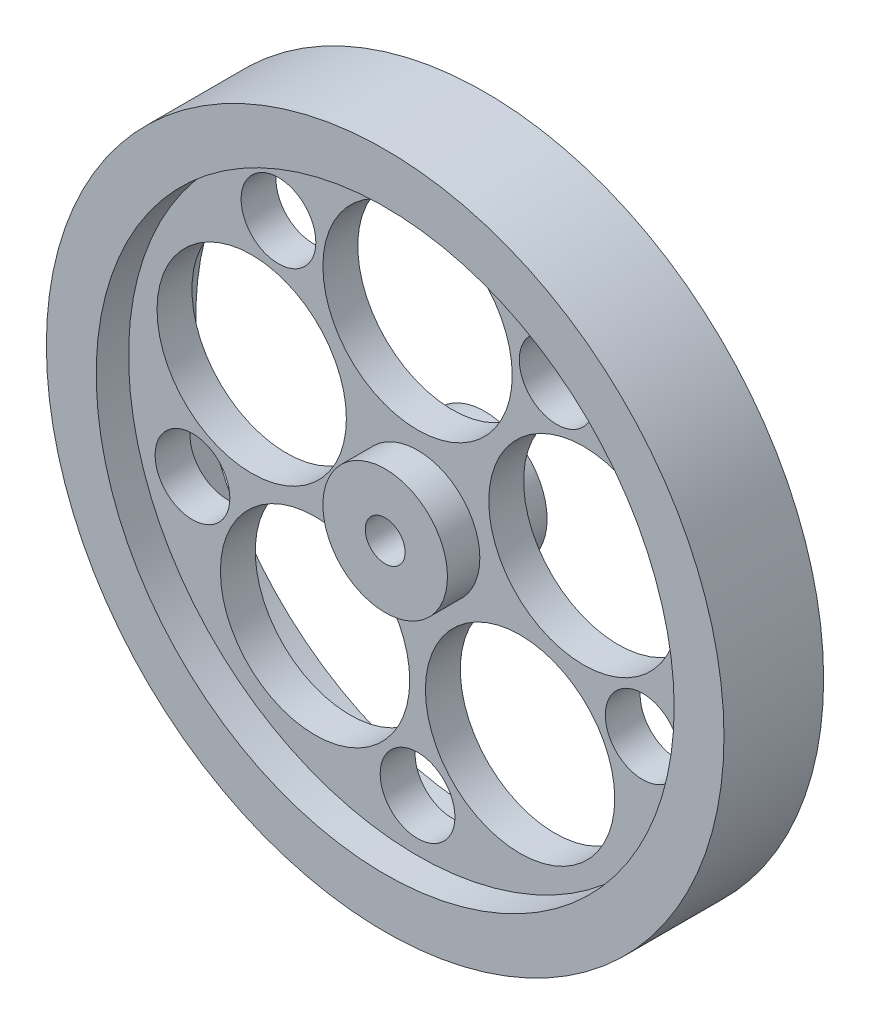
ISO-10303-21;
HEADER;
FILE_DESCRIPTION(('STEP AP214'),'2;1');
FILE_NAME('part.step','',(''),(''),'','','');
FILE_SCHEMA(('AUTOMOTIVE_DESIGN { 1 0 10303 214 1 1 1 1 }'));
ENDSEC;
DATA;
#1=APPLICATION_CONTEXT('core data for automotive mechanical design processes');
#2=APPLICATION_PROTOCOL_DEFINITION('international standard','automotive_design',2000,#1);
#3=PRODUCT_CONTEXT('',#1,'mechanical');
#4=PRODUCT('Part','Part','',(#3));
#5=PRODUCT_RELATED_PRODUCT_CATEGORY('part','',(#4));
#6=PRODUCT_DEFINITION_FORMATION('','',#4);
#7=PRODUCT_DEFINITION_CONTEXT('part definition',#1,'design');
#8=PRODUCT_DEFINITION('design','',#6,#7);
#9=PRODUCT_DEFINITION_SHAPE('','',#8);
#10=(LENGTH_UNIT() NAMED_UNIT(*) SI_UNIT(.MILLI.,.METRE.));
#11=(NAMED_UNIT(*) PLANE_ANGLE_UNIT() SI_UNIT($,.RADIAN.));
#12=(NAMED_UNIT(*) SI_UNIT($,.STERADIAN.) SOLID_ANGLE_UNIT());
#13=UNCERTAINTY_MEASURE_WITH_UNIT(LENGTH_MEASURE(1.E-05),#10,'distance_accuracy_value','');
#14=(GEOMETRIC_REPRESENTATION_CONTEXT(3) GLOBAL_UNCERTAINTY_ASSIGNED_CONTEXT((#13)) GLOBAL_UNIT_ASSIGNED_CONTEXT((#10,
#11,#12)) REPRESENTATION_CONTEXT('',''));
#15=CARTESIAN_POINT('',(0.,0.,0.));
#16=DIRECTION('',(0.,0.,1.));
#17=DIRECTION('',(1.,0.,0.));
#18=AXIS2_PLACEMENT_3D('',#15,#16,#17);
#19=CARTESIAN_POINT('',(0.,58.,10.));
#20=DIRECTION('',(0.,0.,-1.));
#21=DIRECTION('',(-1.,0.,0.));
#22=AXIS2_PLACEMENT_3D('',#19,#20,#21);
#23=PLANE('',#22);
#24=CARTESIAN_POINT('',(0.,0.,10.));
#25=DIRECTION('',(0.,0.,1.));
#26=DIRECTION('',(1.,0.,0.));
#27=AXIS2_PLACEMENT_3D('',#24,#25,#26);
#28=CIRCLE('',#27,58.);
#29=CARTESIAN_POINT('',(58.,0.,10.));
#30=VERTEX_POINT('',#29);
#31=EDGE_CURVE('E101',#30,#30,#28,.T.);
#32=ORIENTED_EDGE('',*,*,#31,.F.);
#33=EDGE_LOOP('',(#32));
#34=FACE_BOUND('',#33,.T.);
#35=CARTESIAN_POINT('',(0.,0.,10.));
#36=DIRECTION('',(0.,0.,1.));
#37=DIRECTION('',(1.,0.,0.));
#38=AXIS2_PLACEMENT_3D('',#35,#36,#37);
#39=CIRCLE('',#38,68.);
#40=CARTESIAN_POINT('',(68.,0.,10.));
#41=VERTEX_POINT('',#40);
#42=EDGE_CURVE('E10',#41,#41,#39,.T.);
#43=ORIENTED_EDGE('',*,*,#42,.T.);
#44=EDGE_LOOP('',(#43));
#45=FACE_BOUND('',#44,.T.);
#46=ADVANCED_FACE('F40',(#34,#45),#23,.F.);
#47=CARTESIAN_POINT('',(0.,0.,51.457627118644));
#48=DIRECTION('',(0.,0.,1.));
#49=DIRECTION('',(1.,0.,0.));
#50=AXIS2_PLACEMENT_3D('',#47,#48,#49);
#51=CYLINDRICAL_SURFACE('',#50,68.);
#52=ORIENTED_EDGE('',*,*,#42,.F.);
#53=EDGE_LOOP('',(#52));
#54=FACE_BOUND('',#53,.T.);
#55=CARTESIAN_POINT('',(0.,0.,-10.));
#56=DIRECTION('',(0.,0.,1.));
#57=DIRECTION('',(1.,0.,0.));
#58=AXIS2_PLACEMENT_3D('',#55,#56,#57);
#59=CIRCLE('',#58,68.);
#60=CARTESIAN_POINT('',(68.,0.,-10.));
#61=VERTEX_POINT('',#60);
#62=EDGE_CURVE('E42',#61,#61,#59,.T.);
#63=ORIENTED_EDGE('',*,*,#62,.T.);
#64=EDGE_LOOP('',(#63));
#65=FACE_BOUND('',#64,.T.);
#66=ADVANCED_FACE('F188',(#54,#65),#51,.T.);
#67=CARTESIAN_POINT('',(0.,68.,-10.));
#68=DIRECTION('',(0.,0.,1.));
#69=DIRECTION('',(1.,0.,0.));
#70=AXIS2_PLACEMENT_3D('',#67,#68,#69);
#71=PLANE('',#70);
#72=ORIENTED_EDGE('',*,*,#62,.F.);
#73=EDGE_LOOP('',(#72));
#74=FACE_BOUND('',#73,.T.);
#75=CARTESIAN_POINT('',(0.,0.,-10.));
#76=DIRECTION('',(0.,0.,1.));
#77=DIRECTION('',(1.,0.,0.));
#78=AXIS2_PLACEMENT_3D('',#75,#76,#77);
#79=CIRCLE('',#78,58.);
#80=CARTESIAN_POINT('',(58.,0.,-10.));
#81=VERTEX_POINT('',#80);
#82=EDGE_CURVE('E47',#81,#81,#79,.T.);
#83=ORIENTED_EDGE('',*,*,#82,.T.);
#84=EDGE_LOOP('',(#83));
#85=FACE_BOUND('',#84,.T.);
#86=ADVANCED_FACE('F128',(#74,#85),#71,.F.);
#87=CARTESIAN_POINT('',(0.,0.,51.457627118644));
#88=DIRECTION('',(0.,0.,1.));
#89=DIRECTION('',(1.,0.,0.));
#90=AXIS2_PLACEMENT_3D('',#87,#88,#89);
#91=CYLINDRICAL_SURFACE('',#90,58.);
#92=ORIENTED_EDGE('',*,*,#82,.F.);
#93=EDGE_LOOP('',(#92));
#94=FACE_BOUND('',#93,.T.);
#95=CARTESIAN_POINT('',(0.,0.,-3.5));
#96=DIRECTION('',(0.,0.,1.));
#97=DIRECTION('',(1.,0.,0.));
#98=AXIS2_PLACEMENT_3D('',#95,#96,#97);
#99=CIRCLE('',#98,58.);
#100=CARTESIAN_POINT('',(58.,0.,-3.5));
#101=VERTEX_POINT('',#100);
#102=EDGE_CURVE('E123',#101,#101,#99,.T.);
#103=ORIENTED_EDGE('',*,*,#102,.T.);
#104=EDGE_LOOP('',(#103));
#105=FACE_BOUND('',#104,.T.);
#106=ADVANCED_FACE('F135',(#94,#105),#91,.F.);
#107=CARTESIAN_POINT('',(0.,58.,-3.5));
#108=DIRECTION('',(0.,0.,1.));
#109=DIRECTION('',(1.,0.,0.));
#110=AXIS2_PLACEMENT_3D('',#107,#108,#109);
#111=PLANE('',#110);
#112=CARTESIAN_POINT('',(-20.5706748132424,-28.3161825883753,-3.5));
#113=DIRECTION('',(0.,0.,1.));
#114=DIRECTION('',(1.,0.,0.));
#115=AXIS2_PLACEMENT_3D('',#112,#113,#114);
#116=CIRCLE('',#115,19.);
#117=CARTESIAN_POINT('',(-1.57067481324243,-28.3161825883753,-3.5));
#118=VERTEX_POINT('',#117);
#119=EDGE_CURVE('E98',#118,#118,#116,.T.);
#120=ORIENTED_EDGE('',*,*,#119,.T.);
#121=EDGE_LOOP('',(#120));
#122=FACE_BOUND('',#121,.T.);
#123=CARTESIAN_POINT('',(20.5742928472308,-28.315007017871,-3.5));
#124=DIRECTION('',(0.,0.,1.));
#125=DIRECTION('',(1.,0.,0.));
#126=AXIS2_PLACEMENT_3D('',#123,#124,#125);
#127=CIRCLE('',#126,19.);
#128=CARTESIAN_POINT('',(39.5742928472308,-28.315007017871,-3.5));
#129=VERTEX_POINT('',#128);
#130=EDGE_CURVE('E88',#129,#129,#127,.T.);
#131=ORIENTED_EDGE('',*,*,#130,.T.);
#132=EDGE_LOOP('',(#131));
#133=FACE_BOUND('',#132,.T.);
#134=CARTESIAN_POINT('',(0.,35.,-3.5));
#135=DIRECTION('',(0.,0.,1.));
#136=DIRECTION('',(1.,0.,0.));
#137=AXIS2_PLACEMENT_3D('',#134,#135,#136);
#138=CIRCLE('',#137,19.);
#139=CARTESIAN_POINT('',(19.,35.,-3.5));
#140=VERTEX_POINT('',#139);
#141=EDGE_CURVE('E84',#140,#140,#138,.T.);
#142=ORIENTED_EDGE('',*,*,#141,.T.);
#143=EDGE_LOOP('',(#142));
#144=FACE_BOUND('',#143,.T.);
#145=CARTESIAN_POINT('',(33.287669053336,10.8165458596394,-3.5));
#146=DIRECTION('',(0.,0.,1.));
#147=DIRECTION('',(1.,0.,0.));
#148=AXIS2_PLACEMENT_3D('',#145,#146,#147);
#149=CIRCLE('',#148,19.);
#150=CARTESIAN_POINT('',(52.2876690533361,10.8165458596394,-3.5));
#151=VERTEX_POINT('',#150);
#152=EDGE_CURVE('E78',#151,#151,#149,.T.);
#153=ORIENTED_EDGE('',*,*,#152,.T.);
#154=EDGE_LOOP('',(#153));
#155=FACE_BOUND('',#154,.T.);
#156=CARTESIAN_POINT('',(-45.1751845240198,-14.67830723281,-3.5));
#157=DIRECTION('',(0.,0.,1.));
#158=DIRECTION('',(1.,0.,0.));
#159=AXIS2_PLACEMENT_3D('',#156,#157,#158);
#160=CIRCLE('',#159,7.50000000000053);
#161=CARTESIAN_POINT('',(-37.6751845240193,-14.67830723281,-3.5));
#162=VERTEX_POINT('',#161);
#163=EDGE_CURVE('E77',#162,#162,#160,.T.);
#164=ORIENTED_EDGE('',*,*,#163,.T.);
#165=EDGE_LOOP('',(#164));
#166=FACE_BOUND('',#165,.T.);
#167=CARTESIAN_POINT('',(-27.9197994838928,38.4283072328097,-3.5));
#168=DIRECTION('',(0.,0.,1.));
#169=DIRECTION('',(1.,0.,0.));
#170=AXIS2_PLACEMENT_3D('',#167,#168,#169);
#171=CIRCLE('',#170,7.50000000000001);
#172=CARTESIAN_POINT('',(-20.4197994838928,38.4283072328097,-3.5));
#173=VERTEX_POINT('',#172);
#174=EDGE_CURVE('E75',#173,#173,#171,.T.);
#175=ORIENTED_EDGE('',*,*,#174,.T.);
#176=EDGE_LOOP('',(#175));
#177=FACE_BOUND('',#176,.T.);
#178=CARTESIAN_POINT('',(27.9197994838923,38.4283072328102,-3.5));
#179=DIRECTION('',(0.,0.,1.));
#180=DIRECTION('',(1.,0.,0.));
#181=AXIS2_PLACEMENT_3D('',#178,#179,#180);
#182=CIRCLE('',#181,7.50000000000001);
#183=CARTESIAN_POINT('',(35.4197994838923,38.4283072328102,-3.5));
#184=VERTEX_POINT('',#183);
#185=EDGE_CURVE('E69',#184,#184,#182,.T.);
#186=ORIENTED_EDGE('',*,*,#185,.T.);
#187=EDGE_LOOP('',(#186));
#188=FACE_BOUND('',#187,.T.);
#189=CARTESIAN_POINT('',(45.1751845240198,-14.6783072328099,-3.5));
#190=DIRECTION('',(0.,0.,1.));
#191=DIRECTION('',(1.,0.,0.));
#192=AXIS2_PLACEMENT_3D('',#189,#190,#191);
#193=CIRCLE('',#192,7.50000000000001);
#194=CARTESIAN_POINT('',(52.6751845240199,-14.6783072328099,-3.5));
#195=VERTEX_POINT('',#194);
#196=EDGE_CURVE('E61',#195,#195,#193,.T.);
#197=ORIENTED_EDGE('',*,*,#196,.T.);
#198=EDGE_LOOP('',(#197));
#199=FACE_BOUND('',#198,.T.);
#200=CARTESIAN_POINT('',(-33.2862870873246,10.8146437466072,-3.5));
#201=DIRECTION('',(0.,0.,1.));
#202=DIRECTION('',(1.,0.,0.));
#203=AXIS2_PLACEMENT_3D('',#200,#201,#202);
#204=CIRCLE('',#203,19.);
#205=CARTESIAN_POINT('',(-14.2862870873246,10.8146437466072,-3.5));
#206=VERTEX_POINT('',#205);
#207=EDGE_CURVE('E58',#206,#206,#204,.T.);
#208=ORIENTED_EDGE('',*,*,#207,.T.);
#209=EDGE_LOOP('',(#208));
#210=FACE_BOUND('',#209,.T.);
#211=CARTESIAN_POINT('',(0.,-47.5,-3.5));
#212=DIRECTION('',(0.,0.,1.));
#213=DIRECTION('',(1.,0.,0.));
#214=AXIS2_PLACEMENT_3D('',#211,#212,#213);
#215=CIRCLE('',#214,7.5);
#216=CARTESIAN_POINT('',(7.5,-47.5,-3.5));
#217=VERTEX_POINT('',#216);
#218=EDGE_CURVE('E57',#217,#217,#215,.T.);
#219=ORIENTED_EDGE('',*,*,#218,.T.);
#220=EDGE_LOOP('',(#219));
#221=FACE_BOUND('',#220,.T.);
#222=ORIENTED_EDGE('',*,*,#102,.F.);
#223=EDGE_LOOP('',(#222));
#224=FACE_BOUND('',#223,.T.);
#225=CARTESIAN_POINT('',(0.,0.,-3.5));
#226=DIRECTION('',(0.,0.,1.));
#227=DIRECTION('',(1.,0.,0.));
#228=AXIS2_PLACEMENT_3D('',#225,#226,#227);
#229=CIRCLE('',#228,12.5);
#230=CARTESIAN_POINT('',(12.5,0.,-3.5));
#231=VERTEX_POINT('',#230);
#232=EDGE_CURVE('E125',#231,#231,#229,.T.);
#233=ORIENTED_EDGE('',*,*,#232,.T.);
#234=EDGE_LOOP('',(#233));
#235=FACE_BOUND('',#234,.T.);
#236=ADVANCED_FACE('F133',(#122,#133,#144,#155,#166,#177,#188,#199,#210,#221,#224,#235),#111,.F.);
#237=CARTESIAN_POINT('',(0.,0.,51.457627118644));
#238=DIRECTION('',(0.,0.,1.));
#239=DIRECTION('',(1.,0.,0.));
#240=AXIS2_PLACEMENT_3D('',#237,#238,#239);
#241=CYLINDRICAL_SURFACE('',#240,12.5);
#242=ORIENTED_EDGE('',*,*,#232,.F.);
#243=EDGE_LOOP('',(#242));
#244=FACE_BOUND('',#243,.T.);
#245=CARTESIAN_POINT('',(0.,0.,-10.));
#246=DIRECTION('',(0.,0.,1.));
#247=DIRECTION('',(1.,0.,0.));
#248=AXIS2_PLACEMENT_3D('',#245,#246,#247);
#249=CIRCLE('',#248,12.5);
#250=CARTESIAN_POINT('',(12.5,0.,-10.));
#251=VERTEX_POINT('',#250);
#252=EDGE_CURVE('E116',#251,#251,#249,.T.);
#253=ORIENTED_EDGE('',*,*,#252,.T.);
#254=EDGE_LOOP('',(#253));
#255=FACE_BOUND('',#254,.T.);
#256=ADVANCED_FACE('F143',(#244,#255),#241,.T.);
#257=CARTESIAN_POINT('',(0.,12.5,-10.));
#258=DIRECTION('',(0.,0.,1.));
#259=DIRECTION('',(1.,0.,0.));
#260=AXIS2_PLACEMENT_3D('',#257,#258,#259);
#261=PLANE('',#260);
#262=ORIENTED_EDGE('',*,*,#252,.F.);
#263=EDGE_LOOP('',(#262));
#264=FACE_BOUND('',#263,.T.);
#265=CARTESIAN_POINT('',(0.,0.,-10.));
#266=DIRECTION('',(0.,0.,1.));
#267=DIRECTION('',(1.,0.,0.));
#268=AXIS2_PLACEMENT_3D('',#265,#266,#267);
#269=CIRCLE('',#268,4.);
#270=CARTESIAN_POINT('',(4.,0.,-10.));
#271=VERTEX_POINT('',#270);
#272=EDGE_CURVE('E117',#271,#271,#269,.T.);
#273=ORIENTED_EDGE('',*,*,#272,.T.);
#274=EDGE_LOOP('',(#273));
#275=FACE_BOUND('',#274,.T.);
#276=ADVANCED_FACE('F146',(#264,#275),#261,.F.);
#277=CARTESIAN_POINT('',(0.,0.,51.457627118644));
#278=DIRECTION('',(0.,0.,1.));
#279=DIRECTION('',(1.,0.,0.));
#280=AXIS2_PLACEMENT_3D('',#277,#278,#279);
#281=CYLINDRICAL_SURFACE('',#280,4.);
#282=ORIENTED_EDGE('',*,*,#272,.F.);
#283=EDGE_LOOP('',(#282));
#284=FACE_BOUND('',#283,.T.);
#285=CARTESIAN_POINT('',(0.,0.,9.99999999999999));
#286=DIRECTION('',(0.,0.,1.));
#287=DIRECTION('',(1.,0.,0.));
#288=AXIS2_PLACEMENT_3D('',#285,#286,#287);
#289=CIRCLE('',#288,4.);
#290=CARTESIAN_POINT('',(4.,0.,9.99999999999999));
#291=VERTEX_POINT('',#290);
#292=EDGE_CURVE('E114',#291,#291,#289,.T.);
#293=ORIENTED_EDGE('',*,*,#292,.T.);
#294=EDGE_LOOP('',(#293));
#295=FACE_BOUND('',#294,.T.);
#296=ADVANCED_FACE('F152',(#284,#295),#281,.F.);
#297=CARTESIAN_POINT('',(0.,4.,9.99999999999999));
#298=DIRECTION('',(0.,0.,-1.));
#299=DIRECTION('',(-1.,0.,0.));
#300=AXIS2_PLACEMENT_3D('',#297,#298,#299);
#301=PLANE('',#300);
#302=ORIENTED_EDGE('',*,*,#292,.F.);
#303=EDGE_LOOP('',(#302));
#304=FACE_BOUND('',#303,.T.);
#305=CARTESIAN_POINT('',(0.,0.,9.99999999999999));
#306=DIRECTION('',(0.,0.,1.));
#307=DIRECTION('',(1.,0.,0.));
#308=AXIS2_PLACEMENT_3D('',#305,#306,#307);
#309=CIRCLE('',#308,12.5);
#310=CARTESIAN_POINT('',(12.5,0.,9.99999999999999));
#311=VERTEX_POINT('',#310);
#312=EDGE_CURVE('E109',#311,#311,#309,.T.);
#313=ORIENTED_EDGE('',*,*,#312,.T.);
#314=EDGE_LOOP('',(#313));
#315=FACE_BOUND('',#314,.T.);
#316=ADVANCED_FACE('F159',(#304,#315),#301,.F.);
#317=CARTESIAN_POINT('',(0.,0.,51.457627118644));
#318=DIRECTION('',(0.,0.,1.));
#319=DIRECTION('',(1.,0.,0.));
#320=AXIS2_PLACEMENT_3D('',#317,#318,#319);
#321=CYLINDRICAL_SURFACE('',#320,12.5);
#322=ORIENTED_EDGE('',*,*,#312,.F.);
#323=EDGE_LOOP('',(#322));
#324=FACE_BOUND('',#323,.T.);
#325=CARTESIAN_POINT('',(0.,0.,3.5));
#326=DIRECTION('',(0.,0.,1.));
#327=DIRECTION('',(1.,0.,0.));
#328=AXIS2_PLACEMENT_3D('',#325,#326,#327);
#329=CIRCLE('',#328,12.5);
#330=CARTESIAN_POINT('',(12.5,0.,3.5));
#331=VERTEX_POINT('',#330);
#332=EDGE_CURVE('E110',#331,#331,#329,.T.);
#333=ORIENTED_EDGE('',*,*,#332,.T.);
#334=EDGE_LOOP('',(#333));
#335=FACE_BOUND('',#334,.T.);
#336=ADVANCED_FACE('F167',(#324,#335),#321,.T.);
#337=CARTESIAN_POINT('',(0.,12.5,3.49999999999999));
#338=DIRECTION('',(0.,0.,-1.));
#339=DIRECTION('',(-1.,0.,0.));
#340=AXIS2_PLACEMENT_3D('',#337,#338,#339);
#341=PLANE('',#340);
#342=CARTESIAN_POINT('',(-20.5706748132424,-28.3161825883753,3.49999999999999));
#343=DIRECTION('',(0.,0.,-1.));
#344=DIRECTION('',(-1.,0.,0.));
#345=AXIS2_PLACEMENT_3D('',#342,#343,#344);
#346=CIRCLE('',#345,19.);
#347=CARTESIAN_POINT('',(-39.5706748132424,-28.3161825883753,3.49999999999999));
#348=VERTEX_POINT('',#347);
#349=EDGE_CURVE('E37',#348,#348,#346,.T.);
#350=ORIENTED_EDGE('',*,*,#349,.T.);
#351=EDGE_LOOP('',(#350));
#352=FACE_BOUND('',#351,.T.);
#353=CARTESIAN_POINT('',(20.5742928472308,-28.315007017871,3.49999999999999));
#354=DIRECTION('',(0.,0.,-1.));
#355=DIRECTION('',(-1.,0.,0.));
#356=AXIS2_PLACEMENT_3D('',#353,#354,#355);
#357=CIRCLE('',#356,19.);
#358=CARTESIAN_POINT('',(1.57429284723077,-28.315007017871,3.49999999999999));
#359=VERTEX_POINT('',#358);
#360=EDGE_CURVE('E81',#359,#359,#357,.T.);
#361=ORIENTED_EDGE('',*,*,#360,.T.);
#362=EDGE_LOOP('',(#361));
#363=FACE_BOUND('',#362,.T.);
#364=CARTESIAN_POINT('',(0.,35.,3.49999999999999));
#365=DIRECTION('',(0.,0.,-1.));
#366=DIRECTION('',(-1.,0.,0.));
#367=AXIS2_PLACEMENT_3D('',#364,#365,#366);
#368=CIRCLE('',#367,19.);
#369=CARTESIAN_POINT('',(-19.,35.,3.49999999999999));
#370=VERTEX_POINT('',#369);
#371=EDGE_CURVE('E82',#370,#370,#368,.T.);
#372=ORIENTED_EDGE('',*,*,#371,.T.);
#373=EDGE_LOOP('',(#372));
#374=FACE_BOUND('',#373,.T.);
#375=CARTESIAN_POINT('',(33.287669053336,10.8165458596394,3.49999999999999));
#376=DIRECTION('',(0.,0.,-1.));
#377=DIRECTION('',(-1.,0.,0.));
#378=AXIS2_PLACEMENT_3D('',#375,#376,#377);
#379=CIRCLE('',#378,19.);
#380=CARTESIAN_POINT('',(14.287669053336,10.8165458596394,3.49999999999999));
#381=VERTEX_POINT('',#380);
#382=EDGE_CURVE('E80',#381,#381,#379,.T.);
#383=ORIENTED_EDGE('',*,*,#382,.T.);
#384=EDGE_LOOP('',(#383));
#385=FACE_BOUND('',#384,.T.);
#386=CARTESIAN_POINT('',(-45.1751845240198,-14.67830723281,3.49999999999999));
#387=DIRECTION('',(0.,0.,-1.));
#388=DIRECTION('',(-1.,0.,0.));
#389=AXIS2_PLACEMENT_3D('',#386,#387,#388);
#390=CIRCLE('',#389,7.50000000000053);
#391=CARTESIAN_POINT('',(-52.6751845240203,-14.67830723281,3.49999999999999));
#392=VERTEX_POINT('',#391);
#393=EDGE_CURVE('E71',#392,#392,#390,.T.);
#394=ORIENTED_EDGE('',*,*,#393,.T.);
#395=EDGE_LOOP('',(#394));
#396=FACE_BOUND('',#395,.T.);
#397=CARTESIAN_POINT('',(-27.9197994838928,38.4283072328097,3.49999999999999));
#398=DIRECTION('',(0.,0.,-1.));
#399=DIRECTION('',(-1.,0.,0.));
#400=AXIS2_PLACEMENT_3D('',#397,#398,#399);
#401=CIRCLE('',#400,7.50000000000001);
#402=CARTESIAN_POINT('',(-35.4197994838928,38.4283072328097,3.49999999999999));
#403=VERTEX_POINT('',#402);
#404=EDGE_CURVE('E66',#403,#403,#401,.T.);
#405=ORIENTED_EDGE('',*,*,#404,.T.);
#406=EDGE_LOOP('',(#405));
#407=FACE_BOUND('',#406,.T.);
#408=CARTESIAN_POINT('',(27.9197994838923,38.4283072328102,3.49999999999999));
#409=DIRECTION('',(0.,0.,-1.));
#410=DIRECTION('',(-1.,0.,0.));
#411=AXIS2_PLACEMENT_3D('',#408,#409,#410);
#412=CIRCLE('',#411,7.50000000000001);
#413=CARTESIAN_POINT('',(20.4197994838923,38.4283072328102,3.49999999999999));
#414=VERTEX_POINT('',#413);
#415=EDGE_CURVE('E63',#414,#414,#412,.T.);
#416=ORIENTED_EDGE('',*,*,#415,.T.);
#417=EDGE_LOOP('',(#416));
#418=FACE_BOUND('',#417,.T.);
#419=CARTESIAN_POINT('',(45.1751845240198,-14.6783072328099,3.49999999999999));
#420=DIRECTION('',(0.,0.,-1.));
#421=DIRECTION('',(-1.,0.,0.));
#422=AXIS2_PLACEMENT_3D('',#419,#420,#421);
#423=CIRCLE('',#422,7.50000000000001);
#424=CARTESIAN_POINT('',(37.6751845240198,-14.6783072328099,3.49999999999999));
#425=VERTEX_POINT('',#424);
#426=EDGE_CURVE('E62',#425,#425,#423,.T.);
#427=ORIENTED_EDGE('',*,*,#426,.T.);
#428=EDGE_LOOP('',(#427));
#429=FACE_BOUND('',#428,.T.);
#430=CARTESIAN_POINT('',(-33.2862870873246,10.8146437466072,3.49999999999999));
#431=DIRECTION('',(0.,0.,-1.));
#432=DIRECTION('',(-1.,0.,0.));
#433=AXIS2_PLACEMENT_3D('',#430,#431,#432);
#434=CIRCLE('',#433,19.);
#435=CARTESIAN_POINT('',(-52.2862870873246,10.8146437466072,3.49999999999999));
#436=VERTEX_POINT('',#435);
#437=EDGE_CURVE('E60',#436,#436,#434,.T.);
#438=ORIENTED_EDGE('',*,*,#437,.T.);
#439=EDGE_LOOP('',(#438));
#440=FACE_BOUND('',#439,.T.);
#441=CARTESIAN_POINT('',(0.,-47.5,3.49999999999999));
#442=DIRECTION('',(0.,0.,-1.));
#443=DIRECTION('',(-1.,0.,0.));
#444=AXIS2_PLACEMENT_3D('',#441,#442,#443);
#445=CIRCLE('',#444,7.5);
#446=CARTESIAN_POINT('',(-7.5,-47.5,3.49999999999999));
#447=VERTEX_POINT('',#446);
#448=EDGE_CURVE('E52',#447,#447,#445,.T.);
#449=ORIENTED_EDGE('',*,*,#448,.T.);
#450=EDGE_LOOP('',(#449));
#451=FACE_BOUND('',#450,.T.);
#452=ORIENTED_EDGE('',*,*,#332,.F.);
#453=EDGE_LOOP('',(#452));
#454=FACE_BOUND('',#453,.T.);
#455=CARTESIAN_POINT('',(0.,0.,3.5));
#456=DIRECTION('',(0.,0.,1.));
#457=DIRECTION('',(1.,0.,0.));
#458=AXIS2_PLACEMENT_3D('',#455,#456,#457);
#459=CIRCLE('',#458,58.);
#460=CARTESIAN_POINT('',(58.,0.,3.5));
#461=VERTEX_POINT('',#460);
#462=EDGE_CURVE('E102',#461,#461,#459,.T.);
#463=ORIENTED_EDGE('',*,*,#462,.T.);
#464=EDGE_LOOP('',(#463));
#465=FACE_BOUND('',#464,.T.);
#466=ADVANCED_FACE('F175',(#352,#363,#374,#385,#396,#407,#418,#429,#440,#451,#454,#465),#341,.F.);
#467=CARTESIAN_POINT('',(0.,0.,51.457627118644));
#468=DIRECTION('',(0.,0.,1.));
#469=DIRECTION('',(1.,0.,0.));
#470=AXIS2_PLACEMENT_3D('',#467,#468,#469);
#471=CYLINDRICAL_SURFACE('',#470,58.);
#472=ORIENTED_EDGE('',*,*,#462,.F.);
#473=EDGE_LOOP('',(#472));
#474=FACE_BOUND('',#473,.T.);
#475=ORIENTED_EDGE('',*,*,#31,.T.);
#476=EDGE_LOOP('',(#475));
#477=FACE_BOUND('',#476,.T.);
#478=ADVANCED_FACE('F179',(#474,#477),#471,.F.);
#479=CARTESIAN_POINT('',(0.,-47.5,-10.));
#480=DIRECTION('',(0.,0.,1.));
#481=DIRECTION('',(1.,0.,0.));
#482=AXIS2_PLACEMENT_3D('',#479,#480,#481);
#483=CYLINDRICAL_SURFACE('',#482,7.5);
#484=ORIENTED_EDGE('',*,*,#448,.F.);
#485=EDGE_LOOP('',(#484));
#486=FACE_BOUND('',#485,.T.);
#487=ORIENTED_EDGE('',*,*,#218,.F.);
#488=EDGE_LOOP('',(#487));
#489=FACE_BOUND('',#488,.T.);
#490=ADVANCED_FACE('F183',(#486,#489),#483,.F.);
#491=CARTESIAN_POINT('',(-33.2862870873246,10.8146437466072,-10.));
#492=DIRECTION('',(0.,0.,1.));
#493=DIRECTION('',(1.,0.,0.));
#494=AXIS2_PLACEMENT_3D('',#491,#492,#493);
#495=CYLINDRICAL_SURFACE('',#494,19.);
#496=ORIENTED_EDGE('',*,*,#437,.F.);
#497=EDGE_LOOP('',(#496));
#498=FACE_BOUND('',#497,.T.);
#499=ORIENTED_EDGE('',*,*,#207,.F.);
#500=EDGE_LOOP('',(#499));
#501=FACE_BOUND('',#500,.T.);
#502=ADVANCED_FACE('F204',(#498,#501),#495,.F.);
#503=CARTESIAN_POINT('',(45.1751845240198,-14.6783072328099,-10.));
#504=DIRECTION('',(0.,0.,1.));
#505=DIRECTION('',(1.,0.,0.));
#506=AXIS2_PLACEMENT_3D('',#503,#504,#505);
#507=CYLINDRICAL_SURFACE('',#506,7.50000000000001);
#508=ORIENTED_EDGE('',*,*,#426,.F.);
#509=EDGE_LOOP('',(#508));
#510=FACE_BOUND('',#509,.T.);
#511=ORIENTED_EDGE('',*,*,#196,.F.);
#512=EDGE_LOOP('',(#511));
#513=FACE_BOUND('',#512,.T.);
#514=ADVANCED_FACE('F217',(#510,#513),#507,.F.);
#515=CARTESIAN_POINT('',(27.9197994838923,38.4283072328102,-10.));
#516=DIRECTION('',(0.,0.,1.));
#517=DIRECTION('',(1.,0.,0.));
#518=AXIS2_PLACEMENT_3D('',#515,#516,#517);
#519=CYLINDRICAL_SURFACE('',#518,7.50000000000001);
#520=ORIENTED_EDGE('',*,*,#415,.F.);
#521=EDGE_LOOP('',(#520));
#522=FACE_BOUND('',#521,.T.);
#523=ORIENTED_EDGE('',*,*,#185,.F.);
#524=EDGE_LOOP('',(#523));
#525=FACE_BOUND('',#524,.T.);
#526=ADVANCED_FACE('F212',(#522,#525),#519,.F.);
#527=CARTESIAN_POINT('',(-27.9197994838928,38.4283072328097,-10.));
#528=DIRECTION('',(0.,0.,1.));
#529=DIRECTION('',(1.,0.,0.));
#530=AXIS2_PLACEMENT_3D('',#527,#528,#529);
#531=CYLINDRICAL_SURFACE('',#530,7.50000000000001);
#532=ORIENTED_EDGE('',*,*,#404,.F.);
#533=EDGE_LOOP('',(#532));
#534=FACE_BOUND('',#533,.T.);
#535=ORIENTED_EDGE('',*,*,#174,.F.);
#536=EDGE_LOOP('',(#535));
#537=FACE_BOUND('',#536,.T.);
#538=ADVANCED_FACE('F209',(#534,#537),#531,.F.);
#539=CARTESIAN_POINT('',(-45.1751845240198,-14.67830723281,-10.));
#540=DIRECTION('',(0.,0.,1.));
#541=DIRECTION('',(1.,0.,0.));
#542=AXIS2_PLACEMENT_3D('',#539,#540,#541);
#543=CYLINDRICAL_SURFACE('',#542,7.50000000000053);
#544=ORIENTED_EDGE('',*,*,#393,.F.);
#545=EDGE_LOOP('',(#544));
#546=FACE_BOUND('',#545,.T.);
#547=ORIENTED_EDGE('',*,*,#163,.F.);
#548=EDGE_LOOP('',(#547));
#549=FACE_BOUND('',#548,.T.);
#550=ADVANCED_FACE('F206',(#546,#549),#543,.F.);
#551=CARTESIAN_POINT('',(33.287669053336,10.8165458596394,-10.));
#552=DIRECTION('',(0.,0.,1.));
#553=DIRECTION('',(1.,0.,0.));
#554=AXIS2_PLACEMENT_3D('',#551,#552,#553);
#555=CYLINDRICAL_SURFACE('',#554,19.);
#556=ORIENTED_EDGE('',*,*,#382,.F.);
#557=EDGE_LOOP('',(#556));
#558=FACE_BOUND('',#557,.T.);
#559=ORIENTED_EDGE('',*,*,#152,.F.);
#560=EDGE_LOOP('',(#559));
#561=FACE_BOUND('',#560,.T.);
#562=ADVANCED_FACE('F207',(#558,#561),#555,.F.);
#563=CARTESIAN_POINT('',(0.,35.,-10.));
#564=DIRECTION('',(0.,0.,1.));
#565=DIRECTION('',(1.,0.,0.));
#566=AXIS2_PLACEMENT_3D('',#563,#564,#565);
#567=CYLINDRICAL_SURFACE('',#566,19.);
#568=ORIENTED_EDGE('',*,*,#371,.F.);
#569=EDGE_LOOP('',(#568));
#570=FACE_BOUND('',#569,.T.);
#571=ORIENTED_EDGE('',*,*,#141,.F.);
#572=EDGE_LOOP('',(#571));
#573=FACE_BOUND('',#572,.T.);
#574=ADVANCED_FACE('F228',(#570,#573),#567,.F.);
#575=CARTESIAN_POINT('',(20.5742928472308,-28.315007017871,-10.));
#576=DIRECTION('',(0.,0.,1.));
#577=DIRECTION('',(1.,0.,0.));
#578=AXIS2_PLACEMENT_3D('',#575,#576,#577);
#579=CYLINDRICAL_SURFACE('',#578,19.);
#580=ORIENTED_EDGE('',*,*,#360,.F.);
#581=EDGE_LOOP('',(#580));
#582=FACE_BOUND('',#581,.T.);
#583=ORIENTED_EDGE('',*,*,#130,.F.);
#584=EDGE_LOOP('',(#583));
#585=FACE_BOUND('',#584,.T.);
#586=ADVANCED_FACE('F227',(#582,#585),#579,.F.);
#587=CARTESIAN_POINT('',(-20.5706748132424,-28.3161825883753,-10.));
#588=DIRECTION('',(0.,0.,1.));
#589=DIRECTION('',(1.,0.,0.));
#590=AXIS2_PLACEMENT_3D('',#587,#588,#589);
#591=CYLINDRICAL_SURFACE('',#590,19.);
#592=ORIENTED_EDGE('',*,*,#349,.F.);
#593=EDGE_LOOP('',(#592));
#594=FACE_BOUND('',#593,.T.);
#595=ORIENTED_EDGE('',*,*,#119,.F.);
#596=EDGE_LOOP('',(#595));
#597=FACE_BOUND('',#596,.T.);
#598=ADVANCED_FACE('F224',(#594,#597),#591,.F.);
#599=CLOSED_SHELL('',(#46,#66,#86,#106,#236,#256,#276,#296,#316,#336,#466,#478,#490,#502,#514,
#526,#538,#550,#562,#574,#586,#598));
#600=MANIFOLD_SOLID_BREP('B2',#599);
#601=ADVANCED_BREP_SHAPE_REPRESENTATION('',(#18,#600),#14);
#602=SHAPE_DEFINITION_REPRESENTATION(#9,#601);
ENDSEC;
END-ISO-10303-21;
